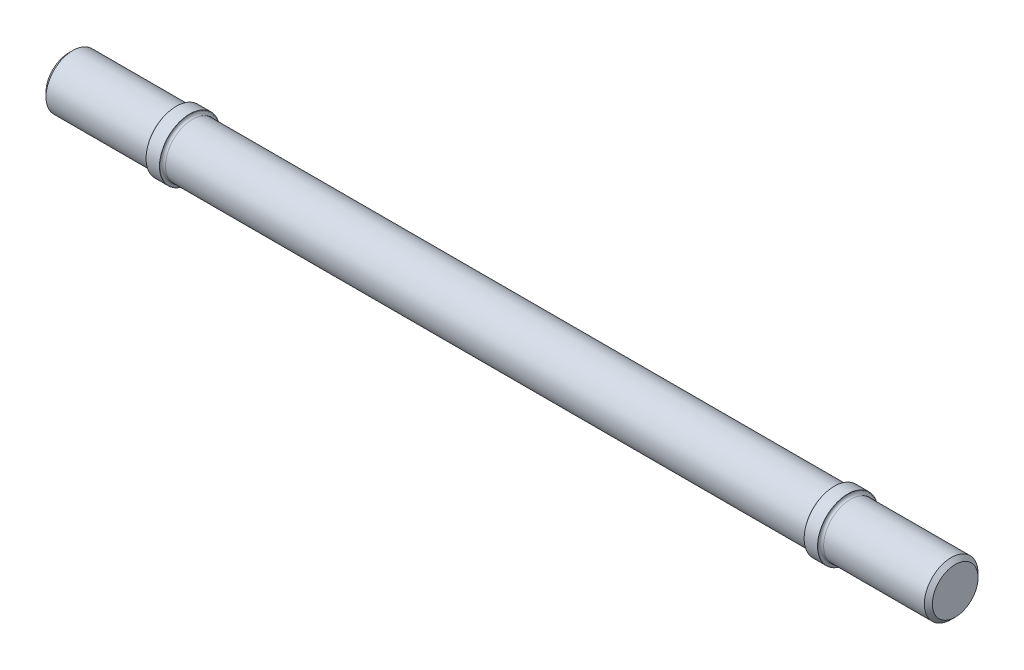
ISO-10303-21;
HEADER;
FILE_DESCRIPTION(('STEP AP214'),'2;1');
FILE_NAME('part.step','',(''),(''),'','','');
FILE_SCHEMA(('AUTOMOTIVE_DESIGN { 1 0 10303 214 1 1 1 1 }'));
ENDSEC;
DATA;
#1=APPLICATION_CONTEXT('core data for automotive mechanical design processes');
#2=APPLICATION_PROTOCOL_DEFINITION('international standard','automotive_design',2000,#1);
#3=PRODUCT_CONTEXT('',#1,'mechanical');
#4=PRODUCT('Part','Part','',(#3));
#5=PRODUCT_RELATED_PRODUCT_CATEGORY('part','',(#4));
#6=PRODUCT_DEFINITION_FORMATION('','',#4);
#7=PRODUCT_DEFINITION_CONTEXT('part definition',#1,'design');
#8=PRODUCT_DEFINITION('design','',#6,#7);
#9=PRODUCT_DEFINITION_SHAPE('','',#8);
#10=(LENGTH_UNIT() NAMED_UNIT(*) SI_UNIT(.MILLI.,.METRE.));
#11=(NAMED_UNIT(*) PLANE_ANGLE_UNIT() SI_UNIT($,.RADIAN.));
#12=(NAMED_UNIT(*) SI_UNIT($,.STERADIAN.) SOLID_ANGLE_UNIT());
#13=UNCERTAINTY_MEASURE_WITH_UNIT(LENGTH_MEASURE(1.E-05),#10,'distance_accuracy_value','');
#14=(GEOMETRIC_REPRESENTATION_CONTEXT(3) GLOBAL_UNCERTAINTY_ASSIGNED_CONTEXT((#13)) GLOBAL_UNIT_ASSIGNED_CONTEXT((#10,
#11,#12)) REPRESENTATION_CONTEXT('',''));
#15=CARTESIAN_POINT('',(0.,0.,0.));
#16=DIRECTION('',(0.,0.,1.));
#17=DIRECTION('',(1.,0.,0.));
#18=AXIS2_PLACEMENT_3D('',#15,#16,#17);
#19=CARTESIAN_POINT('',(66.,0.,0.));
#20=DIRECTION('',(-1.,0.,0.));
#21=DIRECTION('',(0.,0.,1.));
#22=AXIS2_PLACEMENT_3D('',#19,#20,#21);
#23=PLANE('',#22);
#24=CARTESIAN_POINT('',(66.,0.,0.));
#25=DIRECTION('',(-1.,0.,0.));
#26=DIRECTION('',(0.,0.,1.));
#27=AXIS2_PLACEMENT_3D('',#24,#25,#26);
#28=CIRCLE('',#27,1.70000000000002);
#29=CARTESIAN_POINT('',(66.,0.,1.70000000000002));
#30=VERTEX_POINT('',#29);
#31=EDGE_CURVE('E49',#30,#30,#28,.F.);
#32=ORIENTED_EDGE('',*,*,#31,.T.);
#33=EDGE_LOOP('',(#32));
#34=FACE_BOUND('',#33,.T.);
#35=ADVANCED_FACE('F37',(#34),#23,.F.);
#36=CARTESIAN_POINT('',(0.,0.,0.));
#37=DIRECTION('',(-1.,0.,0.));
#38=DIRECTION('',(0.,0.,1.));
#39=AXIS2_PLACEMENT_3D('',#36,#37,#38);
#40=CYLINDRICAL_SURFACE('',#39,2.00000000000002);
#41=CARTESIAN_POINT('',(65.7,0.,0.));
#42=DIRECTION('',(-1.,0.,0.));
#43=DIRECTION('',(0.,0.,1.));
#44=AXIS2_PLACEMENT_3D('',#41,#42,#43);
#45=CIRCLE('',#44,2.00000000000002);
#46=CARTESIAN_POINT('',(65.7,0.,2.00000000000002));
#47=VERTEX_POINT('',#46);
#48=EDGE_CURVE('E53',#47,#47,#45,.T.);
#49=ORIENTED_EDGE('',*,*,#48,.T.);
#50=EDGE_LOOP('',(#49));
#51=FACE_BOUND('',#50,.T.);
#52=CARTESIAN_POINT('',(58.2,0.,0.));
#53=DIRECTION('',(1.,0.,0.));
#54=DIRECTION('',(0.,0.,-1.));
#55=AXIS2_PLACEMENT_3D('',#52,#53,#54);
#56=CIRCLE('',#55,2.00000000000002);
#57=CARTESIAN_POINT('',(58.2,0.,-2.00000000000002));
#58=VERTEX_POINT('',#57);
#59=EDGE_CURVE('E58',#58,#58,#56,.T.);
#60=ORIENTED_EDGE('',*,*,#59,.T.);
#61=EDGE_LOOP('',(#60));
#62=FACE_BOUND('',#61,.T.);
#63=ADVANCED_FACE('F113',(#51,#62),#40,.T.);
#64=CARTESIAN_POINT('',(58.,0.,0.));
#65=DIRECTION('',(1.,0.,0.));
#66=DIRECTION('',(0.,0.,-1.));
#67=AXIS2_PLACEMENT_3D('',#64,#65,#66);
#68=PLANE('',#67);
#69=CARTESIAN_POINT('',(58.,0.,0.));
#70=DIRECTION('',(1.,0.,0.));
#71=DIRECTION('',(0.,0.,-1.));
#72=AXIS2_PLACEMENT_3D('',#69,#70,#71);
#73=CIRCLE('',#72,2.20000000000002);
#74=CARTESIAN_POINT('',(58.,0.,-2.20000000000002));
#75=VERTEX_POINT('',#74);
#76=EDGE_CURVE('E61',#75,#75,#73,.F.);
#77=ORIENTED_EDGE('',*,*,#76,.T.);
#78=EDGE_LOOP('',(#77));
#79=FACE_BOUND('',#78,.T.);
#80=CARTESIAN_POINT('',(58.,0.,0.));
#81=DIRECTION('',(-1.,0.,0.));
#82=DIRECTION('',(0.,0.,1.));
#83=AXIS2_PLACEMENT_3D('',#80,#81,#82);
#84=CIRCLE('',#83,2.25);
#85=CARTESIAN_POINT('',(58.,0.,2.25));
#86=VERTEX_POINT('',#85);
#87=EDGE_CURVE('E82',#86,#86,#84,.T.);
#88=ORIENTED_EDGE('',*,*,#87,.F.);
#89=EDGE_LOOP('',(#88));
#90=FACE_BOUND('',#89,.T.);
#91=ADVANCED_FACE('F119',(#79,#90),#68,.T.);
#92=CARTESIAN_POINT('',(0.,0.,0.));
#93=DIRECTION('',(-1.,0.,0.));
#94=DIRECTION('',(0.,0.,1.));
#95=AXIS2_PLACEMENT_3D('',#92,#93,#94);
#96=CYLINDRICAL_SURFACE('',#95,2.25);
#97=ORIENTED_EDGE('',*,*,#87,.T.);
#98=EDGE_LOOP('',(#97));
#99=FACE_BOUND('',#98,.T.);
#100=CARTESIAN_POINT('',(57.,0.,0.));
#101=DIRECTION('',(-1.,0.,0.));
#102=DIRECTION('',(0.,0.,1.));
#103=AXIS2_PLACEMENT_3D('',#100,#101,#102);
#104=CIRCLE('',#103,2.25);
#105=CARTESIAN_POINT('',(57.,0.,2.25));
#106=VERTEX_POINT('',#105);
#107=EDGE_CURVE('E85',#106,#106,#104,.T.);
#108=ORIENTED_EDGE('',*,*,#107,.F.);
#109=EDGE_LOOP('',(#108));
#110=FACE_BOUND('',#109,.T.);
#111=ADVANCED_FACE('F160',(#99,#110),#96,.T.);
#112=CARTESIAN_POINT('',(57.,0.,0.));
#113=DIRECTION('',(-1.,0.,0.));
#114=DIRECTION('',(0.,0.,1.));
#115=AXIS2_PLACEMENT_3D('',#112,#113,#114);
#116=PLANE('',#115);
#117=CARTESIAN_POINT('',(57.,0.,0.));
#118=DIRECTION('',(-1.,0.,0.));
#119=DIRECTION('',(0.,0.,1.));
#120=AXIS2_PLACEMENT_3D('',#117,#118,#119);
#121=CIRCLE('',#120,2.2);
#122=CARTESIAN_POINT('',(57.,0.,2.2));
#123=VERTEX_POINT('',#122);
#124=EDGE_CURVE('E64',#123,#123,#121,.F.);
#125=ORIENTED_EDGE('',*,*,#124,.T.);
#126=EDGE_LOOP('',(#125));
#127=FACE_BOUND('',#126,.T.);
#128=ORIENTED_EDGE('',*,*,#107,.T.);
#129=EDGE_LOOP('',(#128));
#130=FACE_BOUND('',#129,.T.);
#131=ADVANCED_FACE('F165',(#127,#130),#116,.T.);
#132=CARTESIAN_POINT('',(0.,0.,0.));
#133=DIRECTION('',(-1.,0.,0.));
#134=DIRECTION('',(0.,0.,1.));
#135=AXIS2_PLACEMENT_3D('',#132,#133,#134);
#136=CYLINDRICAL_SURFACE('',#135,2.);
#137=CARTESIAN_POINT('',(9.2,0.,0.));
#138=DIRECTION('',(1.,0.,0.));
#139=DIRECTION('',(0.,0.,-1.));
#140=AXIS2_PLACEMENT_3D('',#137,#138,#139);
#141=CIRCLE('',#140,2.);
#142=CARTESIAN_POINT('',(9.2,0.,-2.));
#143=VERTEX_POINT('',#142);
#144=EDGE_CURVE('E67',#143,#143,#141,.T.);
#145=ORIENTED_EDGE('',*,*,#144,.T.);
#146=EDGE_LOOP('',(#145));
#147=FACE_BOUND('',#146,.T.);
#148=CARTESIAN_POINT('',(56.8,0.,0.));
#149=DIRECTION('',(-1.,0.,0.));
#150=DIRECTION('',(0.,0.,1.));
#151=AXIS2_PLACEMENT_3D('',#148,#149,#150);
#152=CIRCLE('',#151,2.);
#153=CARTESIAN_POINT('',(56.8,0.,2.));
#154=VERTEX_POINT('',#153);
#155=EDGE_CURVE('E70',#154,#154,#152,.T.);
#156=ORIENTED_EDGE('',*,*,#155,.T.);
#157=EDGE_LOOP('',(#156));
#158=FACE_BOUND('',#157,.T.);
#159=ADVANCED_FACE('F109',(#147,#158),#136,.T.);
#160=CARTESIAN_POINT('',(9.,0.,0.));
#161=DIRECTION('',(1.,0.,0.));
#162=DIRECTION('',(0.,0.,-1.));
#163=AXIS2_PLACEMENT_3D('',#160,#161,#162);
#164=PLANE('',#163);
#165=CARTESIAN_POINT('',(9.,0.,0.));
#166=DIRECTION('',(1.,0.,0.));
#167=DIRECTION('',(0.,0.,-1.));
#168=AXIS2_PLACEMENT_3D('',#165,#166,#167);
#169=CIRCLE('',#168,2.2);
#170=CARTESIAN_POINT('',(9.,0.,-2.2));
#171=VERTEX_POINT('',#170);
#172=EDGE_CURVE('E73',#171,#171,#169,.F.);
#173=ORIENTED_EDGE('',*,*,#172,.T.);
#174=EDGE_LOOP('',(#173));
#175=FACE_BOUND('',#174,.T.);
#176=CARTESIAN_POINT('',(9.,0.,0.));
#177=DIRECTION('',(-1.,0.,0.));
#178=DIRECTION('',(0.,0.,1.));
#179=AXIS2_PLACEMENT_3D('',#176,#177,#178);
#180=CIRCLE('',#179,2.25);
#181=CARTESIAN_POINT('',(9.,0.,2.25));
#182=VERTEX_POINT('',#181);
#183=EDGE_CURVE('E88',#182,#182,#180,.T.);
#184=ORIENTED_EDGE('',*,*,#183,.F.);
#185=EDGE_LOOP('',(#184));
#186=FACE_BOUND('',#185,.T.);
#187=ADVANCED_FACE('F99',(#175,#186),#164,.T.);
#188=CARTESIAN_POINT('',(0.,0.,0.));
#189=DIRECTION('',(-1.,0.,0.));
#190=DIRECTION('',(0.,0.,1.));
#191=AXIS2_PLACEMENT_3D('',#188,#189,#190);
#192=CYLINDRICAL_SURFACE('',#191,2.25);
#193=ORIENTED_EDGE('',*,*,#183,.T.);
#194=EDGE_LOOP('',(#193));
#195=FACE_BOUND('',#194,.T.);
#196=CARTESIAN_POINT('',(8.,0.,0.));
#197=DIRECTION('',(-1.,0.,0.));
#198=DIRECTION('',(0.,0.,1.));
#199=AXIS2_PLACEMENT_3D('',#196,#197,#198);
#200=CIRCLE('',#199,2.25);
#201=CARTESIAN_POINT('',(8.,0.,2.25));
#202=VERTEX_POINT('',#201);
#203=EDGE_CURVE('E91',#202,#202,#200,.T.);
#204=ORIENTED_EDGE('',*,*,#203,.F.);
#205=EDGE_LOOP('',(#204));
#206=FACE_BOUND('',#205,.T.);
#207=ADVANCED_FACE('F97',(#195,#206),#192,.T.);
#208=CARTESIAN_POINT('',(8.,0.,0.));
#209=DIRECTION('',(-1.,0.,0.));
#210=DIRECTION('',(0.,0.,1.));
#211=AXIS2_PLACEMENT_3D('',#208,#209,#210);
#212=PLANE('',#211);
#213=CARTESIAN_POINT('',(8.,0.,0.));
#214=DIRECTION('',(-1.,0.,0.));
#215=DIRECTION('',(0.,0.,1.));
#216=AXIS2_PLACEMENT_3D('',#213,#214,#215);
#217=CIRCLE('',#216,2.2);
#218=CARTESIAN_POINT('',(8.,0.,2.2));
#219=VERTEX_POINT('',#218);
#220=EDGE_CURVE('E76',#219,#219,#217,.F.);
#221=ORIENTED_EDGE('',*,*,#220,.T.);
#222=EDGE_LOOP('',(#221));
#223=FACE_BOUND('',#222,.T.);
#224=ORIENTED_EDGE('',*,*,#203,.T.);
#225=EDGE_LOOP('',(#224));
#226=FACE_BOUND('',#225,.T.);
#227=ADVANCED_FACE('F95',(#223,#226),#212,.T.);
#228=CARTESIAN_POINT('',(0.,0.,0.));
#229=DIRECTION('',(-1.,0.,0.));
#230=DIRECTION('',(0.,0.,1.));
#231=AXIS2_PLACEMENT_3D('',#228,#229,#230);
#232=CYLINDRICAL_SURFACE('',#231,2.);
#233=CARTESIAN_POINT('',(0.29999999999999,0.,0.));
#234=DIRECTION('',(-1.,0.,0.));
#235=DIRECTION('',(0.,0.,1.));
#236=AXIS2_PLACEMENT_3D('',#233,#234,#235);
#237=CIRCLE('',#236,2.);
#238=CARTESIAN_POINT('',(0.29999999999999,0.,2.));
#239=VERTEX_POINT('',#238);
#240=EDGE_CURVE('E10',#239,#239,#237,.F.);
#241=ORIENTED_EDGE('',*,*,#240,.T.);
#242=EDGE_LOOP('',(#241));
#243=FACE_BOUND('',#242,.T.);
#244=CARTESIAN_POINT('',(7.8,0.,0.));
#245=DIRECTION('',(-1.,0.,0.));
#246=DIRECTION('',(0.,0.,1.));
#247=AXIS2_PLACEMENT_3D('',#244,#245,#246);
#248=CIRCLE('',#247,2.);
#249=CARTESIAN_POINT('',(7.8,0.,2.));
#250=VERTEX_POINT('',#249);
#251=EDGE_CURVE('E79',#250,#250,#248,.T.);
#252=ORIENTED_EDGE('',*,*,#251,.T.);
#253=EDGE_LOOP('',(#252));
#254=FACE_BOUND('',#253,.T.);
#255=ADVANCED_FACE('F106',(#243,#254),#232,.T.);
#256=CARTESIAN_POINT('',(0.,0.,0.));
#257=DIRECTION('',(-1.,0.,0.));
#258=DIRECTION('',(0.,0.,1.));
#259=AXIS2_PLACEMENT_3D('',#256,#257,#258);
#260=PLANE('',#259);
#261=CARTESIAN_POINT('',(0.,0.,0.));
#262=DIRECTION('',(-1.,0.,0.));
#263=DIRECTION('',(0.,0.,1.));
#264=AXIS2_PLACEMENT_3D('',#261,#262,#263);
#265=CIRCLE('',#264,1.70000000000001);
#266=CARTESIAN_POINT('',(0.,0.,1.70000000000001));
#267=VERTEX_POINT('',#266);
#268=EDGE_CURVE('E45',#267,#267,#265,.T.);
#269=ORIENTED_EDGE('',*,*,#268,.T.);
#270=EDGE_LOOP('',(#269));
#271=FACE_BOUND('',#270,.T.);
#272=ADVANCED_FACE('F128',(#271),#260,.T.);
#273=CARTESIAN_POINT('',(7.8,0.,0.));
#274=DIRECTION('',(-1.,0.,0.));
#275=DIRECTION('',(0.,0.,1.));
#276=AXIS2_PLACEMENT_3D('',#273,#274,#275);
#277=TOROIDAL_SURFACE('',#276,2.2,0.2);
#278=ORIENTED_EDGE('',*,*,#220,.F.);
#279=EDGE_LOOP('',(#278));
#280=FACE_BOUND('',#279,.T.);
#281=ORIENTED_EDGE('',*,*,#251,.F.);
#282=EDGE_LOOP('',(#281));
#283=FACE_BOUND('',#282,.T.);
#284=ADVANCED_FACE('F124',(#280,#283),#277,.F.);
#285=CARTESIAN_POINT('',(9.2,0.,0.));
#286=DIRECTION('',(1.,0.,0.));
#287=DIRECTION('',(0.,0.,-1.));
#288=AXIS2_PLACEMENT_3D('',#285,#286,#287);
#289=TOROIDAL_SURFACE('',#288,2.2,0.2);
#290=ORIENTED_EDGE('',*,*,#144,.F.);
#291=EDGE_LOOP('',(#290));
#292=FACE_BOUND('',#291,.T.);
#293=ORIENTED_EDGE('',*,*,#172,.F.);
#294=EDGE_LOOP('',(#293));
#295=FACE_BOUND('',#294,.T.);
#296=ADVANCED_FACE('F127',(#292,#295),#289,.F.);
#297=CARTESIAN_POINT('',(56.8,0.,0.));
#298=DIRECTION('',(-1.,0.,0.));
#299=DIRECTION('',(0.,0.,1.));
#300=AXIS2_PLACEMENT_3D('',#297,#298,#299);
#301=TOROIDAL_SURFACE('',#300,2.2,0.2);
#302=ORIENTED_EDGE('',*,*,#124,.F.);
#303=EDGE_LOOP('',(#302));
#304=FACE_BOUND('',#303,.T.);
#305=ORIENTED_EDGE('',*,*,#155,.F.);
#306=EDGE_LOOP('',(#305));
#307=FACE_BOUND('',#306,.T.);
#308=ADVANCED_FACE('F132',(#304,#307),#301,.F.);
#309=CARTESIAN_POINT('',(58.2,0.,0.));
#310=DIRECTION('',(1.,0.,0.));
#311=DIRECTION('',(0.,0.,-1.));
#312=AXIS2_PLACEMENT_3D('',#309,#310,#311);
#313=TOROIDAL_SURFACE('',#312,2.20000000000002,0.2);
#314=ORIENTED_EDGE('',*,*,#59,.F.);
#315=EDGE_LOOP('',(#314));
#316=FACE_BOUND('',#315,.T.);
#317=ORIENTED_EDGE('',*,*,#76,.F.);
#318=EDGE_LOOP('',(#317));
#319=FACE_BOUND('',#318,.T.);
#320=ADVANCED_FACE('F136',(#316,#319),#313,.F.);
#321=CARTESIAN_POINT('',(65.7,0.,0.));
#322=DIRECTION('',(-1.,0.,0.));
#323=DIRECTION('',(0.,0.,1.));
#324=AXIS2_PLACEMENT_3D('',#321,#322,#323);
#325=CONICAL_SURFACE('',#324,2.00000000000002,0.785398163397431);
#326=ORIENTED_EDGE('',*,*,#31,.F.);
#327=EDGE_LOOP('',(#326));
#328=FACE_BOUND('',#327,.T.);
#329=ORIENTED_EDGE('',*,*,#48,.F.);
#330=EDGE_LOOP('',(#329));
#331=FACE_BOUND('',#330,.T.);
#332=ADVANCED_FACE('F139',(#328,#331),#325,.T.);
#333=CARTESIAN_POINT('',(0.,0.,0.));
#334=DIRECTION('',(1.,0.,0.));
#335=DIRECTION('',(0.,0.,-1.));
#336=AXIS2_PLACEMENT_3D('',#333,#334,#335);
#337=CONICAL_SURFACE('',#336,1.70000000000001,0.785398163397441);
#338=ORIENTED_EDGE('',*,*,#240,.F.);
#339=EDGE_LOOP('',(#338));
#340=FACE_BOUND('',#339,.T.);
#341=ORIENTED_EDGE('',*,*,#268,.F.);
#342=EDGE_LOOP('',(#341));
#343=FACE_BOUND('',#342,.T.);
#344=ADVANCED_FACE('F40',(#340,#343),#337,.T.);
#345=CLOSED_SHELL('',(#35,#63,#91,#111,#131,#159,#187,#207,#227,#255,#272,#284,#296,#308,#320,
#332,#344));
#346=MANIFOLD_SOLID_BREP('B2',#345);
#347=ADVANCED_BREP_SHAPE_REPRESENTATION('',(#18,#346),#14);
#348=SHAPE_DEFINITION_REPRESENTATION(#9,#347);
ENDSEC;
END-ISO-10303-21;
